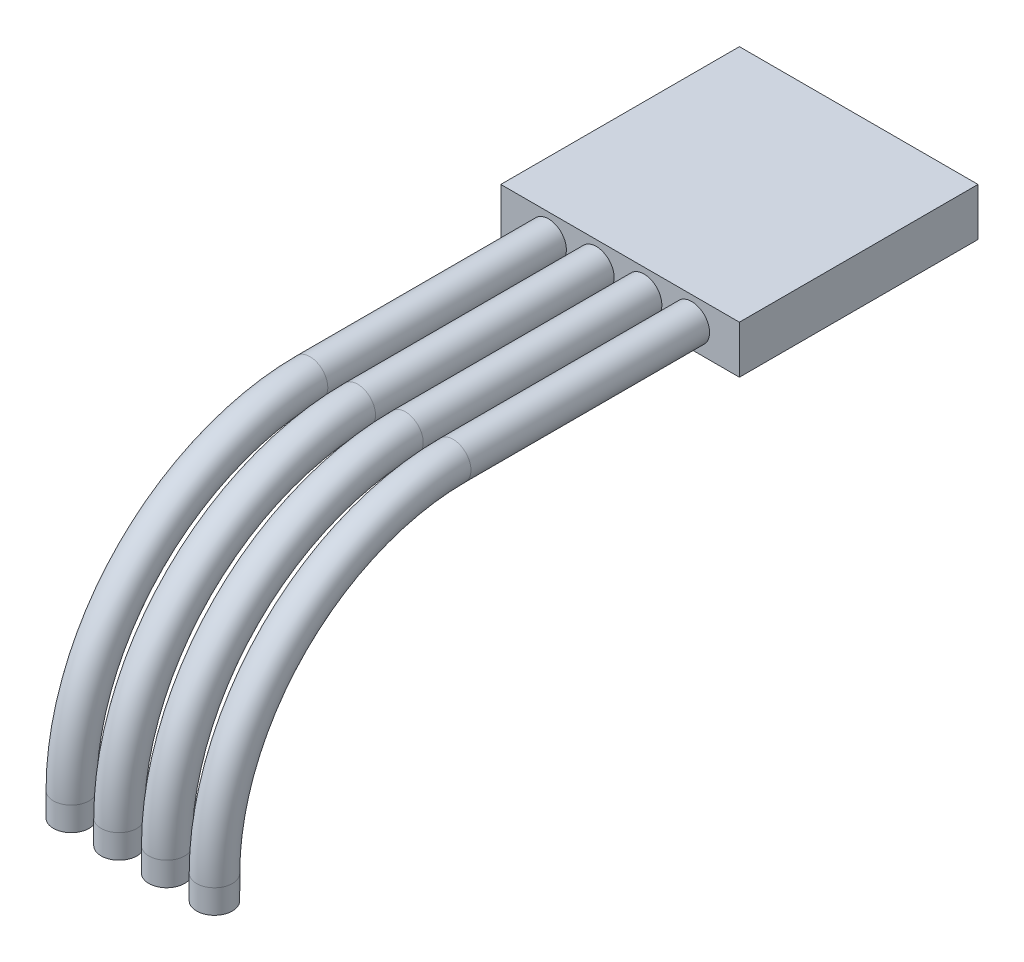
ISO-10303-21;
HEADER;
FILE_DESCRIPTION(('STEP AP214'),'2;1');
FILE_NAME('part.step','',(''),(''),'','','');
FILE_SCHEMA(('AUTOMOTIVE_DESIGN { 1 0 10303 214 1 1 1 1 }'));
ENDSEC;
DATA;
#1=APPLICATION_CONTEXT('core data for automotive mechanical design processes');
#2=APPLICATION_PROTOCOL_DEFINITION('international standard','automotive_design',2000,#1);
#3=PRODUCT_CONTEXT('',#1,'mechanical');
#4=PRODUCT('Part','Part','',(#3));
#5=PRODUCT_RELATED_PRODUCT_CATEGORY('part','',(#4));
#6=PRODUCT_DEFINITION_FORMATION('','',#4);
#7=PRODUCT_DEFINITION_CONTEXT('part definition',#1,'design');
#8=PRODUCT_DEFINITION('design','',#6,#7);
#9=PRODUCT_DEFINITION_SHAPE('','',#8);
#10=(LENGTH_UNIT() NAMED_UNIT(*) SI_UNIT(.MILLI.,.METRE.));
#11=(NAMED_UNIT(*) PLANE_ANGLE_UNIT() SI_UNIT($,.RADIAN.));
#12=(NAMED_UNIT(*) SI_UNIT($,.STERADIAN.) SOLID_ANGLE_UNIT());
#13=UNCERTAINTY_MEASURE_WITH_UNIT(LENGTH_MEASURE(1.E-05),#10,'distance_accuracy_value','');
#14=(GEOMETRIC_REPRESENTATION_CONTEXT(3) GLOBAL_UNCERTAINTY_ASSIGNED_CONTEXT((#13)) GLOBAL_UNIT_ASSIGNED_CONTEXT((#10,
#11,#12)) REPRESENTATION_CONTEXT('',''));
#15=CARTESIAN_POINT('',(0.,0.,0.));
#16=DIRECTION('',(0.,0.,1.));
#17=DIRECTION('',(1.,0.,0.));
#18=AXIS2_PLACEMENT_3D('',#15,#16,#17);
#19=CARTESIAN_POINT('',(5.,-1.,10.));
#20=DIRECTION('',(-1.,0.,0.));
#21=DIRECTION('',(0.,0.,1.));
#22=AXIS2_PLACEMENT_3D('',#19,#20,#21);
#23=PLANE('',#22);
#24=DIRECTION('',(0.,1.,0.));
#25=VECTOR('',#24,1.);
#26=CARTESIAN_POINT('',(5.,-1.,0.));
#27=LINE('',#26,#25);
#28=CARTESIAN_POINT('',(5.,-1.,0.));
#29=VERTEX_POINT('',#28);
#30=CARTESIAN_POINT('',(5.,1.,0.));
#31=VERTEX_POINT('',#30);
#32=EDGE_CURVE('E101',#29,#31,#27,.T.);
#33=ORIENTED_EDGE('',*,*,#32,.T.);
#34=DIRECTION('',(0.,0.,-1.));
#35=VECTOR('',#34,1.);
#36=CARTESIAN_POINT('',(5.,1.,10.));
#37=LINE('',#36,#35);
#38=CARTESIAN_POINT('',(5.,1.,10.));
#39=VERTEX_POINT('',#38);
#40=EDGE_CURVE('E92',#39,#31,#37,.T.);
#41=ORIENTED_EDGE('',*,*,#40,.F.);
#42=DIRECTION('',(0.,1.,0.));
#43=VECTOR('',#42,1.);
#44=CARTESIAN_POINT('',(5.,-1.,10.));
#45=LINE('',#44,#43);
#46=CARTESIAN_POINT('',(5.,-1.,10.));
#47=VERTEX_POINT('',#46);
#48=EDGE_CURVE('E86',#47,#39,#45,.T.);
#49=ORIENTED_EDGE('',*,*,#48,.F.);
#50=DIRECTION('',(0.,0.,-1.));
#51=VECTOR('',#50,1.);
#52=CARTESIAN_POINT('',(5.,-1.,10.));
#53=LINE('',#52,#51);
#54=EDGE_CURVE('E97',#47,#29,#53,.T.);
#55=ORIENTED_EDGE('',*,*,#54,.T.);
#56=EDGE_LOOP('',(#33,#41,#49,#55));
#57=FACE_BOUND('',#56,.T.);
#58=ADVANCED_FACE('F34',(#57),#23,.F.);
#59=CARTESIAN_POINT('',(-5.,1.,10.));
#60=DIRECTION('',(0.,-1.,0.));
#61=DIRECTION('',(0.,0.,-1.));
#62=AXIS2_PLACEMENT_3D('',#59,#60,#61);
#63=PLANE('',#62);
#64=DIRECTION('',(-1.,0.,0.));
#65=VECTOR('',#64,1.);
#66=CARTESIAN_POINT('',(-5.,1.,0.));
#67=LINE('',#66,#65);
#68=CARTESIAN_POINT('',(-5.,1.,0.));
#69=VERTEX_POINT('',#68);
#70=EDGE_CURVE('E91',#31,#69,#67,.T.);
#71=ORIENTED_EDGE('',*,*,#70,.T.);
#72=DIRECTION('',(0.,0.,-1.));
#73=VECTOR('',#72,1.);
#74=CARTESIAN_POINT('',(-5.,1.,10.));
#75=LINE('',#74,#73);
#76=CARTESIAN_POINT('',(-5.,1.,10.));
#77=VERTEX_POINT('',#76);
#78=EDGE_CURVE('E89',#77,#69,#75,.T.);
#79=ORIENTED_EDGE('',*,*,#78,.F.);
#80=DIRECTION('',(-1.,0.,0.));
#81=VECTOR('',#80,1.);
#82=CARTESIAN_POINT('',(-5.,1.,10.));
#83=LINE('',#82,#81);
#84=EDGE_CURVE('E81',#39,#77,#83,.T.);
#85=ORIENTED_EDGE('',*,*,#84,.F.);
#86=ORIENTED_EDGE('',*,*,#40,.T.);
#87=EDGE_LOOP('',(#71,#79,#85,#86));
#88=FACE_BOUND('',#87,.T.);
#89=ADVANCED_FACE('F90',(#88),#63,.F.);
#90=CARTESIAN_POINT('',(-5.,-1.,10.));
#91=DIRECTION('',(1.,0.,0.));
#92=DIRECTION('',(0.,0.,-1.));
#93=AXIS2_PLACEMENT_3D('',#90,#91,#92);
#94=PLANE('',#93);
#95=DIRECTION('',(0.,-1.,0.));
#96=VECTOR('',#95,1.);
#97=CARTESIAN_POINT('',(-5.,-1.,0.));
#98=LINE('',#97,#96);
#99=CARTESIAN_POINT('',(-5.,-1.,0.));
#100=VERTEX_POINT('',#99);
#101=EDGE_CURVE('E67',#69,#100,#98,.T.);
#102=ORIENTED_EDGE('',*,*,#101,.T.);
#103=DIRECTION('',(0.,0.,-1.));
#104=VECTOR('',#103,1.);
#105=CARTESIAN_POINT('',(-5.,-1.,10.));
#106=LINE('',#105,#104);
#107=CARTESIAN_POINT('',(-5.,-1.,10.));
#108=VERTEX_POINT('',#107);
#109=EDGE_CURVE('E93',#108,#100,#106,.T.);
#110=ORIENTED_EDGE('',*,*,#109,.F.);
#111=DIRECTION('',(0.,-1.,0.));
#112=VECTOR('',#111,1.);
#113=CARTESIAN_POINT('',(-5.,-1.,10.));
#114=LINE('',#113,#112);
#115=EDGE_CURVE('E84',#77,#108,#114,.T.);
#116=ORIENTED_EDGE('',*,*,#115,.F.);
#117=ORIENTED_EDGE('',*,*,#78,.T.);
#118=EDGE_LOOP('',(#102,#110,#116,#117));
#119=FACE_BOUND('',#118,.T.);
#120=ADVANCED_FACE('F95',(#119),#94,.F.);
#121=CARTESIAN_POINT('',(-5.,-1.,10.));
#122=DIRECTION('',(0.,1.,0.));
#123=DIRECTION('',(0.,0.,1.));
#124=AXIS2_PLACEMENT_3D('',#121,#122,#123);
#125=PLANE('',#124);
#126=DIRECTION('',(1.,0.,0.));
#127=VECTOR('',#126,1.);
#128=CARTESIAN_POINT('',(-5.,-1.,0.));
#129=LINE('',#128,#127);
#130=EDGE_CURVE('E73',#100,#29,#129,.T.);
#131=ORIENTED_EDGE('',*,*,#130,.T.);
#132=ORIENTED_EDGE('',*,*,#54,.F.);
#133=DIRECTION('',(1.,0.,0.));
#134=VECTOR('',#133,1.);
#135=CARTESIAN_POINT('',(-5.,-1.,10.));
#136=LINE('',#135,#134);
#137=EDGE_CURVE('E50',#108,#47,#136,.T.);
#138=ORIENTED_EDGE('',*,*,#137,.F.);
#139=ORIENTED_EDGE('',*,*,#109,.T.);
#140=EDGE_LOOP('',(#131,#132,#138,#139));
#141=FACE_BOUND('',#140,.T.);
#142=ADVANCED_FACE('F124',(#141),#125,.F.);
#143=CARTESIAN_POINT('',(0.,0.,10.));
#144=DIRECTION('',(0.,0.,-1.));
#145=DIRECTION('',(-1.,0.,0.));
#146=AXIS2_PLACEMENT_3D('',#143,#144,#145);
#147=PLANE('',#146);
#148=CARTESIAN_POINT('',(3.,0.,10.));
#149=DIRECTION('',(0.,0.,-1.));
#150=DIRECTION('',(-1.,0.,0.));
#151=AXIS2_PLACEMENT_3D('',#148,#149,#150);
#152=CIRCLE('',#151,0.75);
#153=CARTESIAN_POINT('',(2.25,0.,10.));
#154=VERTEX_POINT('',#153);
#155=EDGE_CURVE('E11',#154,#154,#152,.F.);
#156=ORIENTED_EDGE('',*,*,#155,.F.);
#157=EDGE_LOOP('',(#156));
#158=FACE_BOUND('',#157,.T.);
#159=CARTESIAN_POINT('',(1.,0.,10.));
#160=DIRECTION('',(0.,0.,-1.));
#161=DIRECTION('',(-1.,0.,0.));
#162=AXIS2_PLACEMENT_3D('',#159,#160,#161);
#163=CIRCLE('',#162,0.75);
#164=CARTESIAN_POINT('',(0.25,0.,10.));
#165=VERTEX_POINT('',#164);
#166=EDGE_CURVE('E42',#165,#165,#163,.F.);
#167=ORIENTED_EDGE('',*,*,#166,.F.);
#168=EDGE_LOOP('',(#167));
#169=FACE_BOUND('',#168,.T.);
#170=CARTESIAN_POINT('',(-3.,0.,10.));
#171=DIRECTION('',(0.,0.,-1.));
#172=DIRECTION('',(-1.,0.,0.));
#173=AXIS2_PLACEMENT_3D('',#170,#171,#172);
#174=CIRCLE('',#173,0.75);
#175=CARTESIAN_POINT('',(-3.75,0.,10.));
#176=VERTEX_POINT('',#175);
#177=EDGE_CURVE('E114',#176,#176,#174,.F.);
#178=ORIENTED_EDGE('',*,*,#177,.F.);
#179=EDGE_LOOP('',(#178));
#180=FACE_BOUND('',#179,.T.);
#181=CARTESIAN_POINT('',(-1.,0.,10.));
#182=DIRECTION('',(0.,0.,-1.));
#183=DIRECTION('',(-1.,0.,0.));
#184=AXIS2_PLACEMENT_3D('',#181,#182,#183);
#185=CIRCLE('',#184,0.75);
#186=CARTESIAN_POINT('',(-1.75,0.,10.));
#187=VERTEX_POINT('',#186);
#188=EDGE_CURVE('E111',#187,#187,#185,.F.);
#189=ORIENTED_EDGE('',*,*,#188,.F.);
#190=EDGE_LOOP('',(#189));
#191=FACE_BOUND('',#190,.T.);
#192=ORIENTED_EDGE('',*,*,#48,.T.);
#193=ORIENTED_EDGE('',*,*,#84,.T.);
#194=ORIENTED_EDGE('',*,*,#115,.T.);
#195=ORIENTED_EDGE('',*,*,#137,.T.);
#196=EDGE_LOOP('',(#192,#193,#194,#195));
#197=FACE_BOUND('',#196,.T.);
#198=ADVANCED_FACE('F82',(#158,#169,#180,#191,#197),#147,.F.);
#199=CARTESIAN_POINT('',(0.,0.,0.));
#200=DIRECTION('',(0.,0.,-1.));
#201=DIRECTION('',(-1.,0.,0.));
#202=AXIS2_PLACEMENT_3D('',#199,#200,#201);
#203=PLANE('',#202);
#204=ORIENTED_EDGE('',*,*,#32,.F.);
#205=ORIENTED_EDGE('',*,*,#130,.F.);
#206=ORIENTED_EDGE('',*,*,#101,.F.);
#207=ORIENTED_EDGE('',*,*,#70,.F.);
#208=EDGE_LOOP('',(#204,#205,#206,#207));
#209=FACE_BOUND('',#208,.T.);
#210=ADVANCED_FACE('F123',(#209),#203,.T.);
#211=CARTESIAN_POINT('',(-1.,0.,20.));
#212=DIRECTION('',(0.,0.,-1.));
#213=DIRECTION('',(-1.,0.,0.));
#214=AXIS2_PLACEMENT_3D('',#211,#212,#213);
#215=CYLINDRICAL_SURFACE('',#214,0.75);
#216=CARTESIAN_POINT('',(-1.,0.,20.));
#217=DIRECTION('',(0.,0.,1.));
#218=DIRECTION('',(1.,0.,0.));
#219=AXIS2_PLACEMENT_3D('',#216,#217,#218);
#220=CIRCLE('',#219,0.75);
#221=CARTESIAN_POINT('',(-1.,0.749999999999999,20.));
#222=VERTEX_POINT('',#221);
#223=EDGE_CURVE('E104',#222,#222,#220,.T.);
#224=ORIENTED_EDGE('',*,*,#223,.F.);
#225=EDGE_LOOP('',(#224));
#226=FACE_BOUND('',#225,.T.);
#227=ORIENTED_EDGE('',*,*,#188,.T.);
#228=EDGE_LOOP('',(#227));
#229=FACE_BOUND('',#228,.T.);
#230=ADVANCED_FACE('F131',(#226,#229),#215,.T.);
#231=CARTESIAN_POINT('',(-3.,0.,20.));
#232=DIRECTION('',(0.,0.,-1.));
#233=DIRECTION('',(-1.,0.,0.));
#234=AXIS2_PLACEMENT_3D('',#231,#232,#233);
#235=CYLINDRICAL_SURFACE('',#234,0.75);
#236=CARTESIAN_POINT('',(-3.,0.,20.));
#237=DIRECTION('',(0.,0.,1.));
#238=DIRECTION('',(1.,0.,0.));
#239=AXIS2_PLACEMENT_3D('',#236,#237,#238);
#240=CIRCLE('',#239,0.75);
#241=CARTESIAN_POINT('',(-3.,0.749999999999999,20.));
#242=VERTEX_POINT('',#241);
#243=EDGE_CURVE('E369',#242,#242,#240,.T.);
#244=ORIENTED_EDGE('',*,*,#243,.F.);
#245=EDGE_LOOP('',(#244));
#246=FACE_BOUND('',#245,.T.);
#247=ORIENTED_EDGE('',*,*,#177,.T.);
#248=EDGE_LOOP('',(#247));
#249=FACE_BOUND('',#248,.T.);
#250=ADVANCED_FACE('F133',(#246,#249),#235,.T.);
#251=CARTESIAN_POINT('',(1.,0.,20.));
#252=DIRECTION('',(0.,0.,-1.));
#253=DIRECTION('',(-1.,0.,0.));
#254=AXIS2_PLACEMENT_3D('',#251,#252,#253);
#255=CYLINDRICAL_SURFACE('',#254,0.75);
#256=CARTESIAN_POINT('',(1.,0.,20.));
#257=DIRECTION('',(0.,0.,1.));
#258=DIRECTION('',(-1.,0.,0.));
#259=AXIS2_PLACEMENT_3D('',#256,#257,#258);
#260=CIRCLE('',#259,0.75);
#261=CARTESIAN_POINT('',(1.,0.749999999999999,20.));
#262=VERTEX_POINT('',#261);
#263=EDGE_CURVE('E366',#262,#262,#260,.T.);
#264=ORIENTED_EDGE('',*,*,#263,.F.);
#265=EDGE_LOOP('',(#264));
#266=FACE_BOUND('',#265,.T.);
#267=ORIENTED_EDGE('',*,*,#166,.T.);
#268=EDGE_LOOP('',(#267));
#269=FACE_BOUND('',#268,.T.);
#270=ADVANCED_FACE('F119',(#266,#269),#255,.T.);
#271=CARTESIAN_POINT('',(3.,0.,20.));
#272=DIRECTION('',(0.,0.,-1.));
#273=DIRECTION('',(-1.,0.,0.));
#274=AXIS2_PLACEMENT_3D('',#271,#272,#273);
#275=CYLINDRICAL_SURFACE('',#274,0.75);
#276=CARTESIAN_POINT('',(3.,0.,20.));
#277=DIRECTION('',(0.,0.,1.));
#278=DIRECTION('',(-1.,0.,0.));
#279=AXIS2_PLACEMENT_3D('',#276,#277,#278);
#280=CIRCLE('',#279,0.75);
#281=CARTESIAN_POINT('',(3.,0.749999999999999,20.));
#282=VERTEX_POINT('',#281);
#283=EDGE_CURVE('E363',#282,#282,#280,.T.);
#284=ORIENTED_EDGE('',*,*,#283,.F.);
#285=EDGE_LOOP('',(#284));
#286=FACE_BOUND('',#285,.T.);
#287=ORIENTED_EDGE('',*,*,#155,.T.);
#288=EDGE_LOOP('',(#287));
#289=FACE_BOUND('',#288,.T.);
#290=ADVANCED_FACE('F202',(#286,#289),#275,.T.);
#291=CARTESIAN_POINT('',(-3.,-10.,30.));
#292=DIRECTION('',(0.,-1.,0.));
#293=DIRECTION('',(0.,0.,-1.));
#294=AXIS2_PLACEMENT_3D('',#291,#292,#293);
#295=CYLINDRICAL_SURFACE('',#294,0.75);
#296=CARTESIAN_POINT('',(-3.,-10.,30.));
#297=DIRECTION('',(0.,-1.,0.));
#298=DIRECTION('',(1.,0.,0.));
#299=AXIS2_PLACEMENT_3D('',#296,#297,#298);
#300=CIRCLE('',#299,0.75);
#301=CARTESIAN_POINT('',(-3.,-10.,30.75));
#302=VERTEX_POINT('',#301);
#303=EDGE_CURVE('E357',#302,#302,#300,.T.);
#304=ORIENTED_EDGE('',*,*,#303,.T.);
#305=EDGE_LOOP('',(#304));
#306=FACE_BOUND('',#305,.T.);
#307=CARTESIAN_POINT('',(-3.,-11.,30.));
#308=DIRECTION('',(0.,-1.,0.));
#309=DIRECTION('',(1.,0.,0.));
#310=AXIS2_PLACEMENT_3D('',#307,#308,#309);
#311=CIRCLE('',#310,0.75);
#312=CARTESIAN_POINT('',(-2.25,-11.,30.));
#313=VERTEX_POINT('',#312);
#314=EDGE_CURVE('E360',#313,#313,#311,.T.);
#315=ORIENTED_EDGE('',*,*,#314,.F.);
#316=EDGE_LOOP('',(#315));
#317=FACE_BOUND('',#316,.T.);
#318=ADVANCED_FACE('F211',(#306,#317),#295,.T.);
#319=CARTESIAN_POINT('',(-3.,-10.,20.));
#320=DIRECTION('',(-1.,0.,0.));
#321=DIRECTION('',(0.,0.,1.));
#322=AXIS2_PLACEMENT_3D('',#319,#320,#321);
#323=TOROIDAL_SURFACE('',#322,10.,0.75);
#324=CARTESIAN_POINT('',(-3.,-10.,20.));
#325=DIRECTION('',(-1.,0.,0.));
#326=DIRECTION('',(0.,0.,1.));
#327=AXIS2_PLACEMENT_3D('',#324,#325,#326);
#328=CIRCLE('',#327,10.75);
#329=EDGE_CURVE('',#302,#242,#328,.T.);
#330=ORIENTED_EDGE('',*,*,#303,.F.);
#331=ORIENTED_EDGE('',*,*,#243,.T.);
#332=ORIENTED_EDGE('',*,*,#329,.T.);
#333=ORIENTED_EDGE('',*,*,#329,.F.);
#334=EDGE_LOOP('',(#330,#332,#331,#333));
#335=FACE_BOUND('',#334,.T.);
#336=ADVANCED_FACE('F220',(#335),#323,.T.);
#337=CARTESIAN_POINT('',(-3.,-11.,30.));
#338=DIRECTION('',(0.,-1.,0.));
#339=DIRECTION('',(1.,0.,0.));
#340=AXIS2_PLACEMENT_3D('',#337,#338,#339);
#341=PLANE('',#340);
#342=ORIENTED_EDGE('',*,*,#314,.T.);
#343=EDGE_LOOP('',(#342));
#344=FACE_BOUND('',#343,.T.);
#345=ADVANCED_FACE('F229',(#344),#341,.T.);
#346=CARTESIAN_POINT('',(-1.,-10.,30.));
#347=DIRECTION('',(0.,-1.,0.));
#348=DIRECTION('',(0.,0.,-1.));
#349=AXIS2_PLACEMENT_3D('',#346,#347,#348);
#350=CYLINDRICAL_SURFACE('',#349,0.75);
#351=CARTESIAN_POINT('',(-1.,-10.,30.));
#352=DIRECTION('',(0.,-1.,0.));
#353=DIRECTION('',(1.,0.,0.));
#354=AXIS2_PLACEMENT_3D('',#351,#352,#353);
#355=CIRCLE('',#354,0.75);
#356=CARTESIAN_POINT('',(-1.,-10.,30.75));
#357=VERTEX_POINT('',#356);
#358=EDGE_CURVE('E351',#357,#357,#355,.T.);
#359=ORIENTED_EDGE('',*,*,#358,.T.);
#360=EDGE_LOOP('',(#359));
#361=FACE_BOUND('',#360,.T.);
#362=CARTESIAN_POINT('',(-1.,-11.,30.));
#363=DIRECTION('',(0.,-1.,0.));
#364=DIRECTION('',(1.,0.,0.));
#365=AXIS2_PLACEMENT_3D('',#362,#363,#364);
#366=CIRCLE('',#365,0.75);
#367=CARTESIAN_POINT('',(-0.25,-11.,30.));
#368=VERTEX_POINT('',#367);
#369=EDGE_CURVE('E354',#368,#368,#366,.T.);
#370=ORIENTED_EDGE('',*,*,#369,.F.);
#371=EDGE_LOOP('',(#370));
#372=FACE_BOUND('',#371,.T.);
#373=ADVANCED_FACE('F238',(#361,#372),#350,.T.);
#374=CARTESIAN_POINT('',(-1.,-10.,20.));
#375=DIRECTION('',(-1.,0.,0.));
#376=DIRECTION('',(0.,0.,1.));
#377=AXIS2_PLACEMENT_3D('',#374,#375,#376);
#378=TOROIDAL_SURFACE('',#377,10.,0.75);
#379=CARTESIAN_POINT('',(-1.,-10.,20.));
#380=DIRECTION('',(-1.,0.,0.));
#381=DIRECTION('',(0.,0.,1.));
#382=AXIS2_PLACEMENT_3D('',#379,#380,#381);
#383=CIRCLE('',#382,10.75);
#384=EDGE_CURVE('',#357,#222,#383,.T.);
#385=ORIENTED_EDGE('',*,*,#358,.F.);
#386=ORIENTED_EDGE('',*,*,#223,.T.);
#387=ORIENTED_EDGE('',*,*,#384,.T.);
#388=ORIENTED_EDGE('',*,*,#384,.F.);
#389=EDGE_LOOP('',(#385,#387,#386,#388));
#390=FACE_BOUND('',#389,.T.);
#391=ADVANCED_FACE('F247',(#390),#378,.T.);
#392=CARTESIAN_POINT('',(-1.,-11.,30.));
#393=DIRECTION('',(0.,-1.,0.));
#394=DIRECTION('',(1.,0.,0.));
#395=AXIS2_PLACEMENT_3D('',#392,#393,#394);
#396=PLANE('',#395);
#397=ORIENTED_EDGE('',*,*,#369,.T.);
#398=EDGE_LOOP('',(#397));
#399=FACE_BOUND('',#398,.T.);
#400=ADVANCED_FACE('F256',(#399),#396,.T.);
#401=CARTESIAN_POINT('',(1.,-10.,30.));
#402=DIRECTION('',(0.,-1.,0.));
#403=DIRECTION('',(0.,0.,-1.));
#404=AXIS2_PLACEMENT_3D('',#401,#402,#403);
#405=CYLINDRICAL_SURFACE('',#404,0.75);
#406=CARTESIAN_POINT('',(1.,-10.,30.));
#407=DIRECTION('',(0.,-1.,0.));
#408=DIRECTION('',(1.,0.,0.));
#409=AXIS2_PLACEMENT_3D('',#406,#407,#408);
#410=CIRCLE('',#409,0.75);
#411=CARTESIAN_POINT('',(1.,-10.,30.75));
#412=VERTEX_POINT('',#411);
#413=EDGE_CURVE('E340',#412,#412,#410,.T.);
#414=ORIENTED_EDGE('',*,*,#413,.T.);
#415=EDGE_LOOP('',(#414));
#416=FACE_BOUND('',#415,.T.);
#417=CARTESIAN_POINT('',(1.,-11.,30.));
#418=DIRECTION('',(0.,-1.,0.));
#419=DIRECTION('',(1.,0.,0.));
#420=AXIS2_PLACEMENT_3D('',#417,#418,#419);
#421=CIRCLE('',#420,0.75);
#422=CARTESIAN_POINT('',(1.75,-11.,30.));
#423=VERTEX_POINT('',#422);
#424=EDGE_CURVE('E344',#423,#423,#421,.T.);
#425=ORIENTED_EDGE('',*,*,#424,.F.);
#426=EDGE_LOOP('',(#425));
#427=FACE_BOUND('',#426,.T.);
#428=ADVANCED_FACE('F265',(#416,#427),#405,.T.);
#429=CARTESIAN_POINT('',(1.,-10.,20.));
#430=DIRECTION('',(-1.,0.,0.));
#431=DIRECTION('',(0.,0.,1.));
#432=AXIS2_PLACEMENT_3D('',#429,#430,#431);
#433=TOROIDAL_SURFACE('',#432,10.,0.75);
#434=CARTESIAN_POINT('',(1.,-10.,20.));
#435=DIRECTION('',(-1.,0.,0.));
#436=DIRECTION('',(0.,0.,1.));
#437=AXIS2_PLACEMENT_3D('',#434,#435,#436);
#438=CIRCLE('',#437,10.75);
#439=EDGE_CURVE('',#412,#262,#438,.T.);
#440=ORIENTED_EDGE('',*,*,#413,.F.);
#441=ORIENTED_EDGE('',*,*,#263,.T.);
#442=ORIENTED_EDGE('',*,*,#439,.T.);
#443=ORIENTED_EDGE('',*,*,#439,.F.);
#444=EDGE_LOOP('',(#440,#442,#441,#443));
#445=FACE_BOUND('',#444,.T.);
#446=ADVANCED_FACE('F274',(#445),#433,.T.);
#447=CARTESIAN_POINT('',(1.,-11.,30.));
#448=DIRECTION('',(0.,-1.,0.));
#449=DIRECTION('',(1.,0.,0.));
#450=AXIS2_PLACEMENT_3D('',#447,#448,#449);
#451=PLANE('',#450);
#452=ORIENTED_EDGE('',*,*,#424,.T.);
#453=EDGE_LOOP('',(#452));
#454=FACE_BOUND('',#453,.T.);
#455=ADVANCED_FACE('F283',(#454),#451,.T.);
#456=CARTESIAN_POINT('',(3.,-10.,30.));
#457=DIRECTION('',(0.,-1.,0.));
#458=DIRECTION('',(0.,0.,-1.));
#459=AXIS2_PLACEMENT_3D('',#456,#457,#458);
#460=CYLINDRICAL_SURFACE('',#459,0.75);
#461=CARTESIAN_POINT('',(3.,-10.,30.));
#462=DIRECTION('',(0.,-1.,0.));
#463=DIRECTION('',(1.,0.,0.));
#464=AXIS2_PLACEMENT_3D('',#461,#462,#463);
#465=CIRCLE('',#464,0.75);
#466=CARTESIAN_POINT('',(3.,-10.,30.75));
#467=VERTEX_POINT('',#466);
#468=EDGE_CURVE('E341',#467,#467,#465,.T.);
#469=ORIENTED_EDGE('',*,*,#468,.T.);
#470=EDGE_LOOP('',(#469));
#471=FACE_BOUND('',#470,.T.);
#472=CARTESIAN_POINT('',(3.,-11.,30.));
#473=DIRECTION('',(0.,-1.,0.));
#474=DIRECTION('',(1.,0.,0.));
#475=AXIS2_PLACEMENT_3D('',#472,#473,#474);
#476=CIRCLE('',#475,0.75);
#477=CARTESIAN_POINT('',(3.75,-11.,30.));
#478=VERTEX_POINT('',#477);
#479=EDGE_CURVE('E338',#478,#478,#476,.T.);
#480=ORIENTED_EDGE('',*,*,#479,.F.);
#481=EDGE_LOOP('',(#480));
#482=FACE_BOUND('',#481,.T.);
#483=ADVANCED_FACE('F292',(#471,#482),#460,.T.);
#484=CARTESIAN_POINT('',(3.,-10.,20.));
#485=DIRECTION('',(-1.,0.,0.));
#486=DIRECTION('',(0.,0.,1.));
#487=AXIS2_PLACEMENT_3D('',#484,#485,#486);
#488=TOROIDAL_SURFACE('',#487,10.,0.75);
#489=CARTESIAN_POINT('',(3.,-10.,20.));
#490=DIRECTION('',(-1.,0.,0.));
#491=DIRECTION('',(0.,0.,1.));
#492=AXIS2_PLACEMENT_3D('',#489,#490,#491);
#493=CIRCLE('',#492,10.75);
#494=EDGE_CURVE('',#467,#282,#493,.T.);
#495=ORIENTED_EDGE('',*,*,#468,.F.);
#496=ORIENTED_EDGE('',*,*,#283,.T.);
#497=ORIENTED_EDGE('',*,*,#494,.T.);
#498=ORIENTED_EDGE('',*,*,#494,.F.);
#499=EDGE_LOOP('',(#495,#497,#496,#498));
#500=FACE_BOUND('',#499,.T.);
#501=ADVANCED_FACE('F301',(#500),#488,.T.);
#502=CARTESIAN_POINT('',(3.,-11.,30.));
#503=DIRECTION('',(0.,-1.,0.));
#504=DIRECTION('',(1.,0.,0.));
#505=AXIS2_PLACEMENT_3D('',#502,#503,#504);
#506=PLANE('',#505);
#507=ORIENTED_EDGE('',*,*,#479,.T.);
#508=EDGE_LOOP('',(#507));
#509=FACE_BOUND('',#508,.T.);
#510=ADVANCED_FACE('F310',(#509),#506,.T.);
#511=CLOSED_SHELL('',(#58,#89,#120,#142,#198,#210,#230,#250,#270,#290,#318,#336,#345,#373,#391,
#400,#428,#446,#455,#483,#501,#510));
#512=MANIFOLD_SOLID_BREP('B2',#511);
#513=ADVANCED_BREP_SHAPE_REPRESENTATION('',(#18,#512),#14);
#514=SHAPE_DEFINITION_REPRESENTATION(#9,#513);
ENDSEC;
END-ISO-10303-21;
